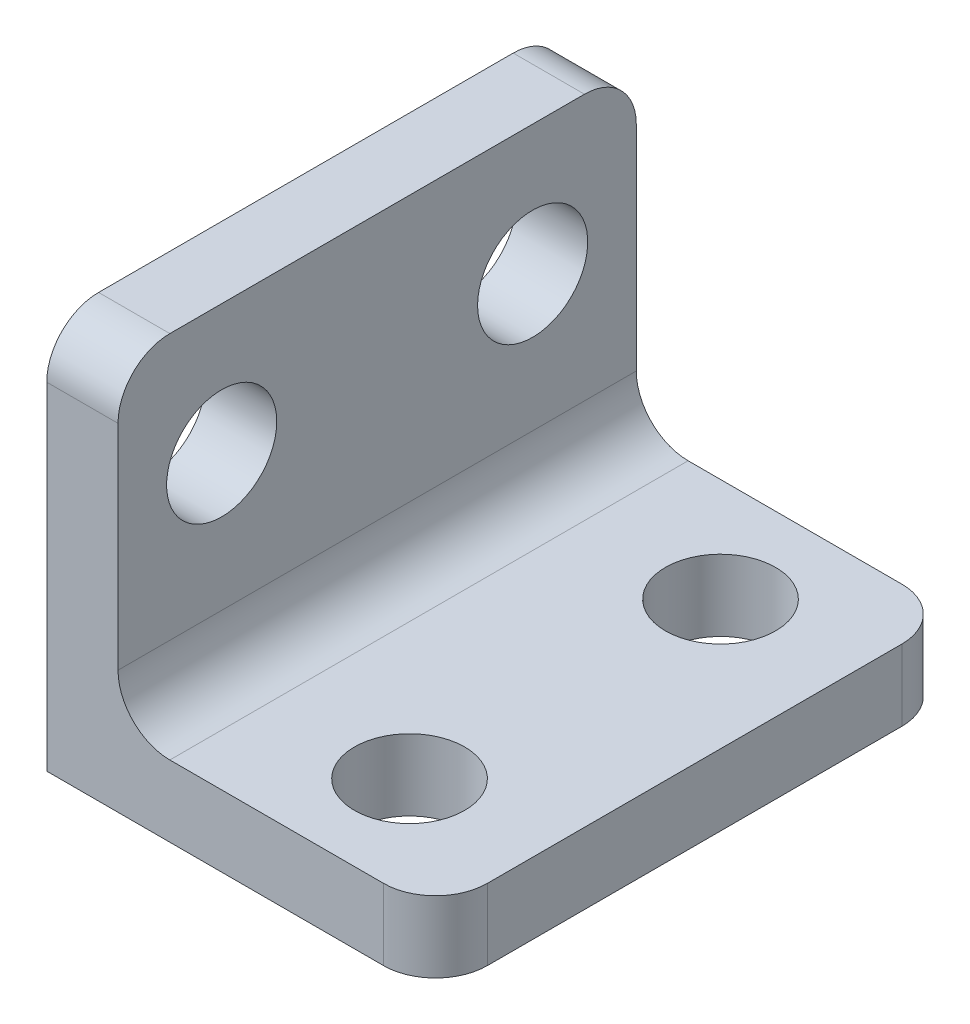
ISO-10303-21;
HEADER;
FILE_DESCRIPTION(('STEP AP214'),'2;1');
FILE_NAME('part.step','',(''),(''),'','','');
FILE_SCHEMA(('AUTOMOTIVE_DESIGN { 1 0 10303 214 1 1 1 1 }'));
ENDSEC;
DATA;
#1=APPLICATION_CONTEXT('core data for automotive mechanical design processes');
#2=APPLICATION_PROTOCOL_DEFINITION('international standard','automotive_design',2000,#1);
#3=PRODUCT_CONTEXT('',#1,'mechanical');
#4=PRODUCT('Part','Part','',(#3));
#5=PRODUCT_RELATED_PRODUCT_CATEGORY('part','',(#4));
#6=PRODUCT_DEFINITION_FORMATION('','',#4);
#7=PRODUCT_DEFINITION_CONTEXT('part definition',#1,'design');
#8=PRODUCT_DEFINITION('design','',#6,#7);
#9=PRODUCT_DEFINITION_SHAPE('','',#8);
#10=(LENGTH_UNIT() NAMED_UNIT(*) SI_UNIT(.MILLI.,.METRE.));
#11=(NAMED_UNIT(*) PLANE_ANGLE_UNIT() SI_UNIT($,.RADIAN.));
#12=(NAMED_UNIT(*) SI_UNIT($,.STERADIAN.) SOLID_ANGLE_UNIT());
#13=UNCERTAINTY_MEASURE_WITH_UNIT(LENGTH_MEASURE(1.E-05),#10,'distance_accuracy_value','');
#14=(GEOMETRIC_REPRESENTATION_CONTEXT(3) GLOBAL_UNCERTAINTY_ASSIGNED_CONTEXT((#13)) GLOBAL_UNIT_ASSIGNED_CONTEXT((#10,
#11,#12)) REPRESENTATION_CONTEXT('',''));
#15=CARTESIAN_POINT('',(0.,0.,0.));
#16=DIRECTION('',(0.,0.,1.));
#17=DIRECTION('',(1.,0.,0.));
#18=AXIS2_PLACEMENT_3D('',#15,#16,#17);
#19=CARTESIAN_POINT('',(0.,2.75,0.));
#20=DIRECTION('',(0.,-1.,0.));
#21=DIRECTION('',(0.,0.,-1.));
#22=AXIS2_PLACEMENT_3D('',#19,#20,#21);
#23=PLANE('',#22);
#24=DIRECTION('',(-1.,0.,0.));
#25=VECTOR('',#24,1.);
#26=CARTESIAN_POINT('',(0.,2.75,-10.));
#27=LINE('',#26,#25);
#28=CARTESIAN_POINT('',(13.,2.75,-10.));
#29=VERTEX_POINT('',#28);
#30=CARTESIAN_POINT('',(4.75,2.75,-10.));
#31=VERTEX_POINT('',#30);
#32=EDGE_CURVE('E243',#29,#31,#27,.T.);
#33=ORIENTED_EDGE('',*,*,#32,.T.);
#34=DIRECTION('',(0.,0.,1.));
#35=VECTOR('',#34,1.);
#36=CARTESIAN_POINT('',(4.75,2.75,0.));
#37=LINE('',#36,#35);
#38=CARTESIAN_POINT('',(4.75,2.75,10.));
#39=VERTEX_POINT('',#38);
#40=EDGE_CURVE('E171',#31,#39,#37,.T.);
#41=ORIENTED_EDGE('',*,*,#40,.T.);
#42=DIRECTION('',(1.,0.,0.));
#43=VECTOR('',#42,1.);
#44=CARTESIAN_POINT('',(0.,2.75,10.));
#45=LINE('',#44,#43);
#46=CARTESIAN_POINT('',(13.,2.75,10.));
#47=VERTEX_POINT('',#46);
#48=EDGE_CURVE('E164',#39,#47,#45,.T.);
#49=ORIENTED_EDGE('',*,*,#48,.T.);
#50=CARTESIAN_POINT('',(13.,2.75,8.));
#51=DIRECTION('',(0.,-1.,0.));
#52=DIRECTION('',(0.,0.,-1.));
#53=AXIS2_PLACEMENT_3D('',#50,#51,#52);
#54=CIRCLE('',#53,2.);
#55=CARTESIAN_POINT('',(15.,2.75,8.));
#56=VERTEX_POINT('',#55);
#57=EDGE_CURVE('E138',#47,#56,#54,.F.);
#58=ORIENTED_EDGE('',*,*,#57,.T.);
#59=DIRECTION('',(0.,0.,-1.));
#60=VECTOR('',#59,1.);
#61=CARTESIAN_POINT('',(15.,2.75,10.));
#62=LINE('',#61,#60);
#63=CARTESIAN_POINT('',(15.,2.75,-8.));
#64=VERTEX_POINT('',#63);
#65=EDGE_CURVE('E159',#56,#64,#62,.T.);
#66=ORIENTED_EDGE('',*,*,#65,.T.);
#67=CARTESIAN_POINT('',(13.,2.75,-8.));
#68=DIRECTION('',(0.,-1.,0.));
#69=DIRECTION('',(0.,0.,-1.));
#70=AXIS2_PLACEMENT_3D('',#67,#68,#69);
#71=CIRCLE('',#70,2.);
#72=EDGE_CURVE('E168',#64,#29,#71,.F.);
#73=ORIENTED_EDGE('',*,*,#72,.T.);
#74=EDGE_LOOP('',(#33,#41,#49,#58,#66,#73));
#75=FACE_BOUND('',#74,.T.);
#76=CARTESIAN_POINT('',(10.,2.75,-6.));
#77=DIRECTION('',(0.,1.,0.));
#78=DIRECTION('',(0.,0.,1.));
#79=AXIS2_PLACEMENT_3D('',#76,#77,#78);
#80=CIRCLE('',#79,2.125);
#81=CARTESIAN_POINT('',(10.,2.75,-3.875));
#82=VERTEX_POINT('',#81);
#83=EDGE_CURVE('E257',#82,#82,#80,.T.);
#84=ORIENTED_EDGE('',*,*,#83,.F.);
#85=EDGE_LOOP('',(#84));
#86=FACE_BOUND('',#85,.T.);
#87=CARTESIAN_POINT('',(10.,2.75,6.));
#88=DIRECTION('',(0.,1.,0.));
#89=DIRECTION('',(0.,0.,-1.));
#90=AXIS2_PLACEMENT_3D('',#87,#88,#89);
#91=CIRCLE('',#90,2.125);
#92=CARTESIAN_POINT('',(10.,2.75,3.875));
#93=VERTEX_POINT('',#92);
#94=EDGE_CURVE('E269',#93,#93,#91,.T.);
#95=ORIENTED_EDGE('',*,*,#94,.F.);
#96=EDGE_LOOP('',(#95));
#97=FACE_BOUND('',#96,.T.);
#98=ADVANCED_FACE('F45',(#75,#86,#97),#23,.F.);
#99=CARTESIAN_POINT('',(0.,0.,0.));
#100=DIRECTION('',(0.,-1.,0.));
#101=DIRECTION('',(0.,0.,-1.));
#102=AXIS2_PLACEMENT_3D('',#99,#100,#101);
#103=PLANE('',#102);
#104=DIRECTION('',(-1.,0.,0.));
#105=VECTOR('',#104,1.);
#106=CARTESIAN_POINT('',(0.,0.,-10.));
#107=LINE('',#106,#105);
#108=CARTESIAN_POINT('',(13.,0.,-10.));
#109=VERTEX_POINT('',#108);
#110=CARTESIAN_POINT('',(0.,0.,-10.));
#111=VERTEX_POINT('',#110);
#112=EDGE_CURVE('E143',#109,#111,#107,.T.);
#113=ORIENTED_EDGE('',*,*,#112,.F.);
#114=CARTESIAN_POINT('',(13.,0.,-8.));
#115=DIRECTION('',(0.,-1.,0.));
#116=DIRECTION('',(0.,0.,-1.));
#117=AXIS2_PLACEMENT_3D('',#114,#115,#116);
#118=CIRCLE('',#117,2.);
#119=CARTESIAN_POINT('',(15.,0.,-8.));
#120=VERTEX_POINT('',#119);
#121=EDGE_CURVE('E192',#109,#120,#118,.T.);
#122=ORIENTED_EDGE('',*,*,#121,.T.);
#123=DIRECTION('',(0.,0.,-1.));
#124=VECTOR('',#123,1.);
#125=CARTESIAN_POINT('',(15.,0.,10.));
#126=LINE('',#125,#124);
#127=CARTESIAN_POINT('',(15.,0.,8.));
#128=VERTEX_POINT('',#127);
#129=EDGE_CURVE('E150',#128,#120,#126,.T.);
#130=ORIENTED_EDGE('',*,*,#129,.F.);
#131=CARTESIAN_POINT('',(13.,0.,8.));
#132=DIRECTION('',(0.,-1.,0.));
#133=DIRECTION('',(0.,0.,-1.));
#134=AXIS2_PLACEMENT_3D('',#131,#132,#133);
#135=CIRCLE('',#134,2.);
#136=CARTESIAN_POINT('',(13.,0.,10.));
#137=VERTEX_POINT('',#136);
#138=EDGE_CURVE('E189',#128,#137,#135,.T.);
#139=ORIENTED_EDGE('',*,*,#138,.T.);
#140=DIRECTION('',(1.,0.,0.));
#141=VECTOR('',#140,1.);
#142=CARTESIAN_POINT('',(0.,0.,10.));
#143=LINE('',#142,#141);
#144=CARTESIAN_POINT('',(0.,0.,10.));
#145=VERTEX_POINT('',#144);
#146=EDGE_CURVE('E155',#145,#137,#143,.T.);
#147=ORIENTED_EDGE('',*,*,#146,.F.);
#148=DIRECTION('',(0.,0.,1.));
#149=VECTOR('',#148,1.);
#150=CARTESIAN_POINT('',(0.,0.,-10.));
#151=LINE('',#150,#149);
#152=EDGE_CURVE('E134',#111,#145,#151,.T.);
#153=ORIENTED_EDGE('',*,*,#152,.F.);
#154=EDGE_LOOP('',(#113,#122,#130,#139,#147,#153));
#155=FACE_BOUND('',#154,.T.);
#156=CARTESIAN_POINT('',(10.,0.,-6.));
#157=DIRECTION('',(0.,1.,0.));
#158=DIRECTION('',(0.,0.,1.));
#159=AXIS2_PLACEMENT_3D('',#156,#157,#158);
#160=CIRCLE('',#159,2.125);
#161=CARTESIAN_POINT('',(10.,0.,-3.875));
#162=VERTEX_POINT('',#161);
#163=EDGE_CURVE('E263',#162,#162,#160,.T.);
#164=ORIENTED_EDGE('',*,*,#163,.T.);
#165=EDGE_LOOP('',(#164));
#166=FACE_BOUND('',#165,.T.);
#167=CARTESIAN_POINT('',(10.,0.,6.));
#168=DIRECTION('',(0.,1.,0.));
#169=DIRECTION('',(0.,0.,-1.));
#170=AXIS2_PLACEMENT_3D('',#167,#168,#169);
#171=CIRCLE('',#170,2.125);
#172=CARTESIAN_POINT('',(10.,0.,3.875));
#173=VERTEX_POINT('',#172);
#174=EDGE_CURVE('E271',#173,#173,#171,.T.);
#175=ORIENTED_EDGE('',*,*,#174,.T.);
#176=EDGE_LOOP('',(#175));
#177=FACE_BOUND('',#176,.T.);
#178=ADVANCED_FACE('F152',(#155,#166,#177),#103,.T.);
#179=CARTESIAN_POINT('',(15.,2.75,10.));
#180=DIRECTION('',(-1.,0.,0.));
#181=DIRECTION('',(0.,0.,1.));
#182=AXIS2_PLACEMENT_3D('',#179,#180,#181);
#183=PLANE('',#182);
#184=ORIENTED_EDGE('',*,*,#129,.T.);
#185=DIRECTION('',(0.,-1.,0.));
#186=VECTOR('',#185,1.);
#187=CARTESIAN_POINT('',(15.,2.75,-8.));
#188=LINE('',#187,#186);
#189=EDGE_CURVE('E199',#120,#64,#188,.F.);
#190=ORIENTED_EDGE('',*,*,#189,.T.);
#191=ORIENTED_EDGE('',*,*,#65,.F.);
#192=DIRECTION('',(0.,-1.,0.));
#193=VECTOR('',#192,1.);
#194=CARTESIAN_POINT('',(15.,2.75,8.));
#195=LINE('',#194,#193);
#196=EDGE_CURVE('E195',#56,#128,#195,.T.);
#197=ORIENTED_EDGE('',*,*,#196,.T.);
#198=EDGE_LOOP('',(#184,#190,#191,#197));
#199=FACE_BOUND('',#198,.T.);
#200=ADVANCED_FACE('F332',(#199),#183,.F.);
#201=CARTESIAN_POINT('',(0.,2.75,-10.));
#202=DIRECTION('',(0.,0.,1.));
#203=DIRECTION('',(1.,0.,0.));
#204=AXIS2_PLACEMENT_3D('',#201,#202,#203);
#205=PLANE('',#204);
#206=ORIENTED_EDGE('',*,*,#32,.F.);
#207=DIRECTION('',(0.,-1.,0.));
#208=VECTOR('',#207,1.);
#209=CARTESIAN_POINT('',(13.,2.75,-10.));
#210=LINE('',#209,#208);
#211=EDGE_CURVE('E147',#29,#109,#210,.T.);
#212=ORIENTED_EDGE('',*,*,#211,.T.);
#213=ORIENTED_EDGE('',*,*,#112,.T.);
#214=DIRECTION('',(0.,-1.,0.));
#215=VECTOR('',#214,1.);
#216=CARTESIAN_POINT('',(0.,2.75,-10.));
#217=LINE('',#216,#215);
#218=CARTESIAN_POINT('',(0.,13.,-10.));
#219=VERTEX_POINT('',#218);
#220=EDGE_CURVE('E129',#219,#111,#217,.T.);
#221=ORIENTED_EDGE('',*,*,#220,.F.);
#222=DIRECTION('',(-1.,0.,0.));
#223=VECTOR('',#222,1.);
#224=CARTESIAN_POINT('',(2.75,13.,-10.));
#225=LINE('',#224,#223);
#226=CARTESIAN_POINT('',(2.75,13.,-10.));
#227=VERTEX_POINT('',#226);
#228=EDGE_CURVE('E184',#219,#227,#225,.F.);
#229=ORIENTED_EDGE('',*,*,#228,.T.);
#230=DIRECTION('',(0.,-1.,0.));
#231=VECTOR('',#230,1.);
#232=CARTESIAN_POINT('',(2.75,0.,-10.));
#233=LINE('',#232,#231);
#234=CARTESIAN_POINT('',(2.75,4.75,-10.));
#235=VERTEX_POINT('',#234);
#236=EDGE_CURVE('E238',#227,#235,#233,.T.);
#237=ORIENTED_EDGE('',*,*,#236,.T.);
#238=CARTESIAN_POINT('',(4.75,4.75,-10.));
#239=DIRECTION('',(0.,0.,1.));
#240=DIRECTION('',(1.,0.,0.));
#241=AXIS2_PLACEMENT_3D('',#238,#239,#240);
#242=CIRCLE('',#241,2.);
#243=EDGE_CURVE('E11',#235,#31,#242,.T.);
#244=ORIENTED_EDGE('',*,*,#243,.T.);
#245=EDGE_LOOP('',(#206,#212,#213,#221,#229,#237,#244));
#246=FACE_BOUND('',#245,.T.);
#247=ADVANCED_FACE('F145',(#246),#205,.F.);
#248=CARTESIAN_POINT('',(0.,2.75,-10.));
#249=DIRECTION('',(1.,0.,0.));
#250=DIRECTION('',(0.,0.,-1.));
#251=AXIS2_PLACEMENT_3D('',#248,#249,#250);
#252=PLANE('',#251);
#253=DIRECTION('',(0.,0.,-1.));
#254=VECTOR('',#253,1.);
#255=CARTESIAN_POINT('',(0.,15.,-10.));
#256=LINE('',#255,#254);
#257=CARTESIAN_POINT('',(0.,15.,8.));
#258=VERTEX_POINT('',#257);
#259=CARTESIAN_POINT('',(0.,15.,-8.));
#260=VERTEX_POINT('',#259);
#261=EDGE_CURVE('E278',#258,#260,#256,.T.);
#262=ORIENTED_EDGE('',*,*,#261,.T.);
#263=CARTESIAN_POINT('',(0.,13.,-8.));
#264=DIRECTION('',(1.,0.,0.));
#265=DIRECTION('',(0.,0.,-1.));
#266=AXIS2_PLACEMENT_3D('',#263,#264,#265);
#267=CIRCLE('',#266,2.);
#268=EDGE_CURVE('E61',#260,#219,#267,.F.);
#269=ORIENTED_EDGE('',*,*,#268,.T.);
#270=ORIENTED_EDGE('',*,*,#220,.T.);
#271=ORIENTED_EDGE('',*,*,#152,.T.);
#272=DIRECTION('',(0.,-1.,0.));
#273=VECTOR('',#272,1.);
#274=CARTESIAN_POINT('',(0.,2.75,10.));
#275=LINE('',#274,#273);
#276=CARTESIAN_POINT('',(0.,13.,10.));
#277=VERTEX_POINT('',#276);
#278=EDGE_CURVE('E139',#277,#145,#275,.T.);
#279=ORIENTED_EDGE('',*,*,#278,.F.);
#280=CARTESIAN_POINT('',(0.,13.,8.));
#281=DIRECTION('',(1.,0.,0.));
#282=DIRECTION('',(0.,0.,-1.));
#283=AXIS2_PLACEMENT_3D('',#280,#281,#282);
#284=CIRCLE('',#283,2.);
#285=EDGE_CURVE('E69',#277,#258,#284,.F.);
#286=ORIENTED_EDGE('',*,*,#285,.T.);
#287=EDGE_LOOP('',(#262,#269,#270,#271,#279,#286));
#288=FACE_BOUND('',#287,.T.);
#289=CARTESIAN_POINT('',(0.,10.,6.));
#290=DIRECTION('',(-1.,0.,0.));
#291=DIRECTION('',(0.,0.,-1.));
#292=AXIS2_PLACEMENT_3D('',#289,#290,#291);
#293=CIRCLE('',#292,2.125);
#294=CARTESIAN_POINT('',(0.,10.,3.875));
#295=VERTEX_POINT('',#294);
#296=EDGE_CURVE('E295',#295,#295,#293,.T.);
#297=ORIENTED_EDGE('',*,*,#296,.F.);
#298=EDGE_LOOP('',(#297));
#299=FACE_BOUND('',#298,.T.);
#300=CARTESIAN_POINT('',(0.,10.,-6.));
#301=DIRECTION('',(-1.,0.,0.));
#302=DIRECTION('',(0.,0.,1.));
#303=AXIS2_PLACEMENT_3D('',#300,#301,#302);
#304=CIRCLE('',#303,2.125);
#305=CARTESIAN_POINT('',(0.,10.,-3.875));
#306=VERTEX_POINT('',#305);
#307=EDGE_CURVE('E287',#306,#306,#304,.T.);
#308=ORIENTED_EDGE('',*,*,#307,.F.);
#309=EDGE_LOOP('',(#308));
#310=FACE_BOUND('',#309,.T.);
#311=ADVANCED_FACE('F131',(#288,#299,#310),#252,.F.);
#312=CARTESIAN_POINT('',(0.,2.75,10.));
#313=DIRECTION('',(0.,0.,-1.));
#314=DIRECTION('',(-1.,0.,0.));
#315=AXIS2_PLACEMENT_3D('',#312,#313,#314);
#316=PLANE('',#315);
#317=ORIENTED_EDGE('',*,*,#146,.T.);
#318=DIRECTION('',(0.,-1.,0.));
#319=VECTOR('',#318,1.);
#320=CARTESIAN_POINT('',(13.,2.75,10.));
#321=LINE('',#320,#319);
#322=EDGE_CURVE('E206',#137,#47,#321,.F.);
#323=ORIENTED_EDGE('',*,*,#322,.T.);
#324=ORIENTED_EDGE('',*,*,#48,.F.);
#325=CARTESIAN_POINT('',(4.75,4.75,10.));
#326=DIRECTION('',(0.,0.,-1.));
#327=DIRECTION('',(-1.,0.,0.));
#328=AXIS2_PLACEMENT_3D('',#325,#326,#327);
#329=CIRCLE('',#328,2.);
#330=CARTESIAN_POINT('',(2.75,4.75,10.));
#331=VERTEX_POINT('',#330);
#332=EDGE_CURVE('E54',#39,#331,#329,.T.);
#333=ORIENTED_EDGE('',*,*,#332,.T.);
#334=DIRECTION('',(0.,1.,0.));
#335=VECTOR('',#334,1.);
#336=CARTESIAN_POINT('',(2.75,0.,10.));
#337=LINE('',#336,#335);
#338=CARTESIAN_POINT('',(2.75,13.,10.));
#339=VERTEX_POINT('',#338);
#340=EDGE_CURVE('E224',#331,#339,#337,.T.);
#341=ORIENTED_EDGE('',*,*,#340,.T.);
#342=DIRECTION('',(-1.,0.,0.));
#343=VECTOR('',#342,1.);
#344=CARTESIAN_POINT('',(0.,13.,10.));
#345=LINE('',#344,#343);
#346=EDGE_CURVE('E202',#339,#277,#345,.T.);
#347=ORIENTED_EDGE('',*,*,#346,.T.);
#348=ORIENTED_EDGE('',*,*,#278,.T.);
#349=EDGE_LOOP('',(#317,#323,#324,#333,#341,#347,#348));
#350=FACE_BOUND('',#349,.T.);
#351=ADVANCED_FACE('F223',(#350),#316,.F.);
#352=CARTESIAN_POINT('',(10.,2.75,-6.));
#353=DIRECTION('',(0.,-1.,0.));
#354=DIRECTION('',(0.,0.,-1.));
#355=AXIS2_PLACEMENT_3D('',#352,#353,#354);
#356=CYLINDRICAL_SURFACE('',#355,2.125);
#357=ORIENTED_EDGE('',*,*,#83,.T.);
#358=EDGE_LOOP('',(#357));
#359=FACE_BOUND('',#358,.T.);
#360=ORIENTED_EDGE('',*,*,#163,.F.);
#361=EDGE_LOOP('',(#360));
#362=FACE_BOUND('',#361,.T.);
#363=ADVANCED_FACE('F335',(#359,#362),#356,.F.);
#364=CARTESIAN_POINT('',(10.,2.75,6.));
#365=DIRECTION('',(0.,-1.,0.));
#366=DIRECTION('',(0.,0.,-1.));
#367=AXIS2_PLACEMENT_3D('',#364,#365,#366);
#368=CYLINDRICAL_SURFACE('',#367,2.125);
#369=ORIENTED_EDGE('',*,*,#94,.T.);
#370=EDGE_LOOP('',(#369));
#371=FACE_BOUND('',#370,.T.);
#372=ORIENTED_EDGE('',*,*,#174,.F.);
#373=EDGE_LOOP('',(#372));
#374=FACE_BOUND('',#373,.T.);
#375=ADVANCED_FACE('F415',(#371,#374),#368,.F.);
#376=CARTESIAN_POINT('',(2.75,0.,0.));
#377=DIRECTION('',(1.,0.,0.));
#378=DIRECTION('',(0.,0.,-1.));
#379=AXIS2_PLACEMENT_3D('',#376,#377,#378);
#380=PLANE('',#379);
#381=CARTESIAN_POINT('',(2.75,10.,-6.));
#382=DIRECTION('',(-1.,0.,0.));
#383=DIRECTION('',(0.,0.,1.));
#384=AXIS2_PLACEMENT_3D('',#381,#382,#383);
#385=CIRCLE('',#384,2.125);
#386=CARTESIAN_POINT('',(2.75,10.,-3.875));
#387=VERTEX_POINT('',#386);
#388=EDGE_CURVE('E281',#387,#387,#385,.T.);
#389=ORIENTED_EDGE('',*,*,#388,.T.);
#390=EDGE_LOOP('',(#389));
#391=FACE_BOUND('',#390,.T.);
#392=CARTESIAN_POINT('',(2.75,10.,6.));
#393=DIRECTION('',(-1.,0.,0.));
#394=DIRECTION('',(0.,0.,-1.));
#395=AXIS2_PLACEMENT_3D('',#392,#393,#394);
#396=CIRCLE('',#395,2.125);
#397=CARTESIAN_POINT('',(2.75,10.,3.875));
#398=VERTEX_POINT('',#397);
#399=EDGE_CURVE('E291',#398,#398,#396,.T.);
#400=ORIENTED_EDGE('',*,*,#399,.T.);
#401=EDGE_LOOP('',(#400));
#402=FACE_BOUND('',#401,.T.);
#403=ORIENTED_EDGE('',*,*,#340,.F.);
#404=DIRECTION('',(0.,0.,1.));
#405=VECTOR('',#404,1.);
#406=CARTESIAN_POINT('',(2.75,4.75,0.));
#407=LINE('',#406,#405);
#408=EDGE_CURVE('E181',#331,#235,#407,.F.);
#409=ORIENTED_EDGE('',*,*,#408,.T.);
#410=ORIENTED_EDGE('',*,*,#236,.F.);
#411=CARTESIAN_POINT('',(2.75,13.,-8.));
#412=DIRECTION('',(1.,0.,0.));
#413=DIRECTION('',(0.,0.,-1.));
#414=AXIS2_PLACEMENT_3D('',#411,#412,#413);
#415=CIRCLE('',#414,2.);
#416=CARTESIAN_POINT('',(2.75,15.,-8.));
#417=VERTEX_POINT('',#416);
#418=EDGE_CURVE('E178',#227,#417,#415,.T.);
#419=ORIENTED_EDGE('',*,*,#418,.T.);
#420=DIRECTION('',(0.,0.,-1.));
#421=VECTOR('',#420,1.);
#422=CARTESIAN_POINT('',(2.75,15.,-10.));
#423=LINE('',#422,#421);
#424=CARTESIAN_POINT('',(2.75,15.,8.));
#425=VERTEX_POINT('',#424);
#426=EDGE_CURVE('E237',#425,#417,#423,.T.);
#427=ORIENTED_EDGE('',*,*,#426,.F.);
#428=CARTESIAN_POINT('',(2.75,13.,8.));
#429=DIRECTION('',(1.,0.,0.));
#430=DIRECTION('',(0.,0.,-1.));
#431=AXIS2_PLACEMENT_3D('',#428,#429,#430);
#432=CIRCLE('',#431,2.);
#433=EDGE_CURVE('E175',#425,#339,#432,.T.);
#434=ORIENTED_EDGE('',*,*,#433,.T.);
#435=EDGE_LOOP('',(#403,#409,#410,#419,#427,#434));
#436=FACE_BOUND('',#435,.T.);
#437=ADVANCED_FACE('F231',(#391,#402,#436),#380,.T.);
#438=CARTESIAN_POINT('',(2.75,15.,-10.));
#439=DIRECTION('',(0.,1.,0.));
#440=DIRECTION('',(0.,0.,1.));
#441=AXIS2_PLACEMENT_3D('',#438,#439,#440);
#442=PLANE('',#441);
#443=ORIENTED_EDGE('',*,*,#426,.T.);
#444=DIRECTION('',(-1.,0.,0.));
#445=VECTOR('',#444,1.);
#446=CARTESIAN_POINT('',(0.,15.,-8.));
#447=LINE('',#446,#445);
#448=EDGE_CURVE('E212',#417,#260,#447,.T.);
#449=ORIENTED_EDGE('',*,*,#448,.T.);
#450=ORIENTED_EDGE('',*,*,#261,.F.);
#451=DIRECTION('',(-1.,0.,0.));
#452=VECTOR('',#451,1.);
#453=CARTESIAN_POINT('',(2.75,15.,8.));
#454=LINE('',#453,#452);
#455=EDGE_CURVE('E209',#258,#425,#454,.F.);
#456=ORIENTED_EDGE('',*,*,#455,.T.);
#457=EDGE_LOOP('',(#443,#449,#450,#456));
#458=FACE_BOUND('',#457,.T.);
#459=ADVANCED_FACE('F316',(#458),#442,.T.);
#460=CARTESIAN_POINT('',(2.75,10.,-6.));
#461=DIRECTION('',(-1.,0.,0.));
#462=DIRECTION('',(0.,0.,1.));
#463=AXIS2_PLACEMENT_3D('',#460,#461,#462);
#464=CYLINDRICAL_SURFACE('',#463,2.125);
#465=ORIENTED_EDGE('',*,*,#388,.F.);
#466=EDGE_LOOP('',(#465));
#467=FACE_BOUND('',#466,.T.);
#468=ORIENTED_EDGE('',*,*,#307,.T.);
#469=EDGE_LOOP('',(#468));
#470=FACE_BOUND('',#469,.T.);
#471=ADVANCED_FACE('F307',(#467,#470),#464,.F.);
#472=CARTESIAN_POINT('',(2.75,10.,6.));
#473=DIRECTION('',(-1.,0.,0.));
#474=DIRECTION('',(0.,0.,1.));
#475=AXIS2_PLACEMENT_3D('',#472,#473,#474);
#476=CYLINDRICAL_SURFACE('',#475,2.125);
#477=ORIENTED_EDGE('',*,*,#399,.F.);
#478=EDGE_LOOP('',(#477));
#479=FACE_BOUND('',#478,.T.);
#480=ORIENTED_EDGE('',*,*,#296,.T.);
#481=EDGE_LOOP('',(#480));
#482=FACE_BOUND('',#481,.T.);
#483=ADVANCED_FACE('F304',(#479,#482),#476,.F.);
#484=CARTESIAN_POINT('',(4.75,4.75,0.));
#485=DIRECTION('',(0.,0.,1.));
#486=DIRECTION('',(1.,0.,0.));
#487=AXIS2_PLACEMENT_3D('',#484,#485,#486);
#488=CYLINDRICAL_SURFACE('',#487,2.);
#489=ORIENTED_EDGE('',*,*,#243,.F.);
#490=ORIENTED_EDGE('',*,*,#408,.F.);
#491=ORIENTED_EDGE('',*,*,#332,.F.);
#492=ORIENTED_EDGE('',*,*,#40,.F.);
#493=EDGE_LOOP('',(#489,#490,#491,#492));
#494=FACE_BOUND('',#493,.T.);
#495=ADVANCED_FACE('F241',(#494),#488,.F.);
#496=CARTESIAN_POINT('',(13.,2.75,-8.));
#497=DIRECTION('',(0.,-1.,0.));
#498=DIRECTION('',(0.,0.,-1.));
#499=AXIS2_PLACEMENT_3D('',#496,#497,#498);
#500=CYLINDRICAL_SURFACE('',#499,2.);
#501=ORIENTED_EDGE('',*,*,#72,.F.);
#502=ORIENTED_EDGE('',*,*,#189,.F.);
#503=ORIENTED_EDGE('',*,*,#121,.F.);
#504=ORIENTED_EDGE('',*,*,#211,.F.);
#505=EDGE_LOOP('',(#501,#502,#503,#504));
#506=FACE_BOUND('',#505,.T.);
#507=ADVANCED_FACE('F346',(#506),#500,.T.);
#508=CARTESIAN_POINT('',(13.,2.75,8.));
#509=DIRECTION('',(0.,-1.,0.));
#510=DIRECTION('',(0.,0.,-1.));
#511=AXIS2_PLACEMENT_3D('',#508,#509,#510);
#512=CYLINDRICAL_SURFACE('',#511,2.);
#513=ORIENTED_EDGE('',*,*,#57,.F.);
#514=ORIENTED_EDGE('',*,*,#322,.F.);
#515=ORIENTED_EDGE('',*,*,#138,.F.);
#516=ORIENTED_EDGE('',*,*,#196,.F.);
#517=EDGE_LOOP('',(#513,#514,#515,#516));
#518=FACE_BOUND('',#517,.T.);
#519=ADVANCED_FACE('F349',(#518),#512,.T.);
#520=CARTESIAN_POINT('',(2.75,13.,-8.));
#521=DIRECTION('',(1.,0.,0.));
#522=DIRECTION('',(0.,0.,-1.));
#523=AXIS2_PLACEMENT_3D('',#520,#521,#522);
#524=CYLINDRICAL_SURFACE('',#523,2.);
#525=ORIENTED_EDGE('',*,*,#418,.F.);
#526=ORIENTED_EDGE('',*,*,#228,.F.);
#527=ORIENTED_EDGE('',*,*,#268,.F.);
#528=ORIENTED_EDGE('',*,*,#448,.F.);
#529=EDGE_LOOP('',(#525,#526,#527,#528));
#530=FACE_BOUND('',#529,.T.);
#531=ADVANCED_FACE('F352',(#530),#524,.T.);
#532=CARTESIAN_POINT('',(0.,13.,8.));
#533=DIRECTION('',(1.,0.,0.));
#534=DIRECTION('',(0.,0.,-1.));
#535=AXIS2_PLACEMENT_3D('',#532,#533,#534);
#536=CYLINDRICAL_SURFACE('',#535,2.);
#537=ORIENTED_EDGE('',*,*,#433,.F.);
#538=ORIENTED_EDGE('',*,*,#455,.F.);
#539=ORIENTED_EDGE('',*,*,#285,.F.);
#540=ORIENTED_EDGE('',*,*,#346,.F.);
#541=EDGE_LOOP('',(#537,#538,#539,#540));
#542=FACE_BOUND('',#541,.T.);
#543=ADVANCED_FACE('F47',(#542),#536,.T.);
#544=CLOSED_SHELL('',(#98,#178,#200,#247,#311,#351,#363,#375,#437,#459,#471,#483,#495,#507,#519,
#531,#543));
#545=MANIFOLD_SOLID_BREP('B2',#544);
#546=ADVANCED_BREP_SHAPE_REPRESENTATION('',(#18,#545),#14);
#547=SHAPE_DEFINITION_REPRESENTATION(#9,#546);
ENDSEC;
END-ISO-10303-21;
